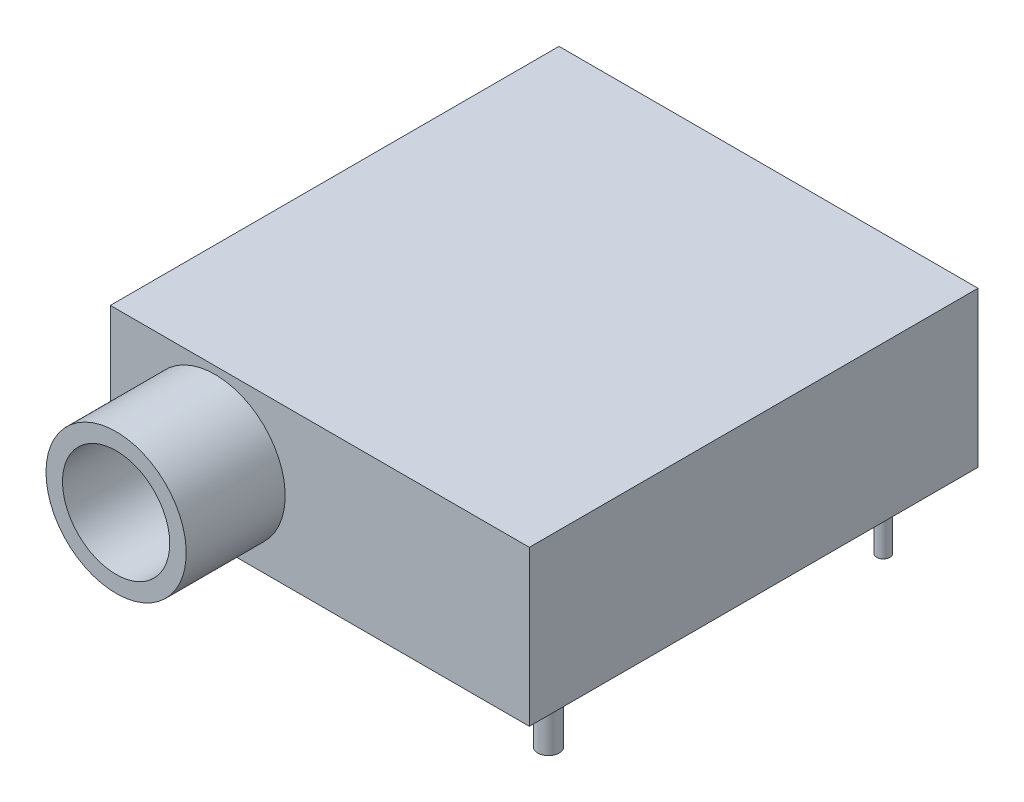
ISO-10303-21;
HEADER;
FILE_DESCRIPTION(('STEP AP214'),'2;1');
FILE_NAME('part.step','',(''),(''),'','','');
FILE_SCHEMA(('AUTOMOTIVE_DESIGN { 1 0 10303 214 1 1 1 1 }'));
ENDSEC;
DATA;
#1=APPLICATION_CONTEXT('core data for automotive mechanical design processes');
#2=APPLICATION_PROTOCOL_DEFINITION('international standard','automotive_design',2000,#1);
#3=PRODUCT_CONTEXT('',#1,'mechanical');
#4=PRODUCT('Part','Part','',(#3));
#5=PRODUCT_RELATED_PRODUCT_CATEGORY('part','',(#4));
#6=PRODUCT_DEFINITION_FORMATION('','',#4);
#7=PRODUCT_DEFINITION_CONTEXT('part definition',#1,'design');
#8=PRODUCT_DEFINITION('design','',#6,#7);
#9=PRODUCT_DEFINITION_SHAPE('','',#8);
#10=(LENGTH_UNIT() NAMED_UNIT(*) SI_UNIT(.MILLI.,.METRE.));
#11=(NAMED_UNIT(*) PLANE_ANGLE_UNIT() SI_UNIT($,.RADIAN.));
#12=(NAMED_UNIT(*) SI_UNIT($,.STERADIAN.) SOLID_ANGLE_UNIT());
#13=UNCERTAINTY_MEASURE_WITH_UNIT(LENGTH_MEASURE(1.E-05),#10,'distance_accuracy_value','');
#14=(GEOMETRIC_REPRESENTATION_CONTEXT(3) GLOBAL_UNCERTAINTY_ASSIGNED_CONTEXT((#13)) GLOBAL_UNIT_ASSIGNED_CONTEXT((#10,
#11,#12)) REPRESENTATION_CONTEXT('',''));
#15=CARTESIAN_POINT('',(0.,0.,0.));
#16=DIRECTION('',(0.,0.,1.));
#17=DIRECTION('',(1.,0.,0.));
#18=AXIS2_PLACEMENT_3D('',#15,#16,#17);
#19=CARTESIAN_POINT('',(0.,-4.7,0.));
#20=DIRECTION('',(0.,1.,0.));
#21=DIRECTION('',(0.,0.,1.));
#22=AXIS2_PLACEMENT_3D('',#19,#20,#21);
#23=PLANE('',#22);
#24=CARTESIAN_POINT('',(7.62,-4.7,-10.4));
#25=DIRECTION('',(0.,1.,0.));
#26=DIRECTION('',(0.,0.,1.));
#27=AXIS2_PLACEMENT_3D('',#24,#25,#26);
#28=CIRCLE('',#27,0.399999999999999);
#29=CARTESIAN_POINT('',(7.62,-4.7,-10.));
#30=VERTEX_POINT('',#29);
#31=EDGE_CURVE('E44',#30,#30,#28,.F.);
#32=ORIENTED_EDGE('',*,*,#31,.F.);
#33=EDGE_LOOP('',(#32));
#34=FACE_BOUND('',#33,.T.);
#35=CARTESIAN_POINT('',(2.54,-4.7,-10.4));
#36=DIRECTION('',(0.,1.,0.));
#37=DIRECTION('',(0.,0.,1.));
#38=AXIS2_PLACEMENT_3D('',#35,#36,#37);
#39=CIRCLE('',#38,0.399999999999999);
#40=CARTESIAN_POINT('',(2.54,-4.7,-10.));
#41=VERTEX_POINT('',#40);
#42=EDGE_CURVE('E138',#41,#41,#39,.F.);
#43=ORIENTED_EDGE('',*,*,#42,.F.);
#44=EDGE_LOOP('',(#43));
#45=FACE_BOUND('',#44,.T.);
#46=CARTESIAN_POINT('',(-2.54,-4.7,-10.4));
#47=DIRECTION('',(0.,1.,0.));
#48=DIRECTION('',(0.,0.,1.));
#49=AXIS2_PLACEMENT_3D('',#46,#47,#48);
#50=CIRCLE('',#49,0.399999999999999);
#51=CARTESIAN_POINT('',(-2.54,-4.7,-10.));
#52=VERTEX_POINT('',#51);
#53=EDGE_CURVE('E132',#52,#52,#50,.F.);
#54=ORIENTED_EDGE('',*,*,#53,.F.);
#55=EDGE_LOOP('',(#54));
#56=FACE_BOUND('',#55,.T.);
#57=CARTESIAN_POINT('',(-7.62,-4.7,-10.4));
#58=DIRECTION('',(0.,1.,0.));
#59=DIRECTION('',(0.,0.,1.));
#60=AXIS2_PLACEMENT_3D('',#57,#58,#59);
#61=CIRCLE('',#60,0.399999999999999);
#62=CARTESIAN_POINT('',(-7.62,-4.7,-10.));
#63=VERTEX_POINT('',#62);
#64=EDGE_CURVE('E126',#63,#63,#61,.F.);
#65=ORIENTED_EDGE('',*,*,#64,.F.);
#66=EDGE_LOOP('',(#65));
#67=FACE_BOUND('',#66,.T.);
#68=CARTESIAN_POINT('',(10.16,-4.7,9.9));
#69=DIRECTION('',(0.,1.,0.));
#70=DIRECTION('',(0.,0.,1.));
#71=AXIS2_PLACEMENT_3D('',#68,#69,#70);
#72=CIRCLE('',#71,0.649999999999999);
#73=CARTESIAN_POINT('',(10.16,-4.7,10.55));
#74=VERTEX_POINT('',#73);
#75=EDGE_CURVE('E120',#74,#74,#72,.F.);
#76=ORIENTED_EDGE('',*,*,#75,.F.);
#77=EDGE_LOOP('',(#76));
#78=FACE_BOUND('',#77,.T.);
#79=DIRECTION('',(0.,0.,1.));
#80=VECTOR('',#79,1.);
#81=CARTESIAN_POINT('',(-12.7,-4.7,-13.6));
#82=LINE('',#81,#80);
#83=CARTESIAN_POINT('',(-12.7,-4.7,-13.6));
#84=VERTEX_POINT('',#83);
#85=CARTESIAN_POINT('',(-12.7,-4.7,13.6));
#86=VERTEX_POINT('',#85);
#87=EDGE_CURVE('E80',#84,#86,#82,.T.);
#88=ORIENTED_EDGE('',*,*,#87,.F.);
#89=DIRECTION('',(-1.,0.,0.));
#90=VECTOR('',#89,1.);
#91=CARTESIAN_POINT('',(-12.7,-4.7,-13.6));
#92=LINE('',#91,#90);
#93=CARTESIAN_POINT('',(12.7,-4.7,-13.6));
#94=VERTEX_POINT('',#93);
#95=EDGE_CURVE('E85',#94,#84,#92,.T.);
#96=ORIENTED_EDGE('',*,*,#95,.F.);
#97=DIRECTION('',(0.,0.,-1.));
#98=VECTOR('',#97,1.);
#99=CARTESIAN_POINT('',(12.7,-4.7,-13.6));
#100=LINE('',#99,#98);
#101=CARTESIAN_POINT('',(12.7,-4.7,13.6));
#102=VERTEX_POINT('',#101);
#103=EDGE_CURVE('E111',#102,#94,#100,.T.);
#104=ORIENTED_EDGE('',*,*,#103,.F.);
#105=DIRECTION('',(1.,0.,0.));
#106=VECTOR('',#105,1.);
#107=CARTESIAN_POINT('',(-12.7,-4.7,13.6));
#108=LINE('',#107,#106);
#109=EDGE_CURVE('E109',#86,#102,#108,.T.);
#110=ORIENTED_EDGE('',*,*,#109,.F.);
#111=EDGE_LOOP('',(#88,#96,#104,#110));
#112=FACE_BOUND('',#111,.T.);
#113=CARTESIAN_POINT('',(-10.16,-4.7,9.9));
#114=DIRECTION('',(0.,1.,0.));
#115=DIRECTION('',(0.,0.,1.));
#116=AXIS2_PLACEMENT_3D('',#113,#114,#115);
#117=CIRCLE('',#116,0.649999999999999);
#118=CARTESIAN_POINT('',(-10.16,-4.7,10.55));
#119=VERTEX_POINT('',#118);
#120=EDGE_CURVE('E115',#119,#119,#117,.F.);
#121=ORIENTED_EDGE('',*,*,#120,.F.);
#122=EDGE_LOOP('',(#121));
#123=FACE_BOUND('',#122,.T.);
#124=CARTESIAN_POINT('',(-10.16,-4.7,-10.4));
#125=DIRECTION('',(0.,1.,0.));
#126=DIRECTION('',(0.,0.,1.));
#127=AXIS2_PLACEMENT_3D('',#124,#125,#126);
#128=CIRCLE('',#127,0.399999999999999);
#129=CARTESIAN_POINT('',(-10.16,-4.7,-10.));
#130=VERTEX_POINT('',#129);
#131=EDGE_CURVE('E123',#130,#130,#128,.F.);
#132=ORIENTED_EDGE('',*,*,#131,.F.);
#133=EDGE_LOOP('',(#132));
#134=FACE_BOUND('',#133,.T.);
#135=CARTESIAN_POINT('',(-5.08,-4.7,-10.4));
#136=DIRECTION('',(0.,1.,0.));
#137=DIRECTION('',(0.,0.,1.));
#138=AXIS2_PLACEMENT_3D('',#135,#136,#137);
#139=CIRCLE('',#138,0.399999999999999);
#140=CARTESIAN_POINT('',(-5.08,-4.7,-10.));
#141=VERTEX_POINT('',#140);
#142=EDGE_CURVE('E129',#141,#141,#139,.F.);
#143=ORIENTED_EDGE('',*,*,#142,.F.);
#144=EDGE_LOOP('',(#143));
#145=FACE_BOUND('',#144,.T.);
#146=CARTESIAN_POINT('',(0.,-4.7,-10.4));
#147=DIRECTION('',(0.,1.,0.));
#148=DIRECTION('',(0.,0.,1.));
#149=AXIS2_PLACEMENT_3D('',#146,#147,#148);
#150=CIRCLE('',#149,0.399999999999999);
#151=CARTESIAN_POINT('',(0.,-4.7,-10.));
#152=VERTEX_POINT('',#151);
#153=EDGE_CURVE('E135',#152,#152,#150,.F.);
#154=ORIENTED_EDGE('',*,*,#153,.F.);
#155=EDGE_LOOP('',(#154));
#156=FACE_BOUND('',#155,.T.);
#157=CARTESIAN_POINT('',(5.08,-4.7,-10.4));
#158=DIRECTION('',(0.,1.,0.));
#159=DIRECTION('',(0.,0.,1.));
#160=AXIS2_PLACEMENT_3D('',#157,#158,#159);
#161=CIRCLE('',#160,0.399999999999999);
#162=CARTESIAN_POINT('',(5.08,-4.7,-10.));
#163=VERTEX_POINT('',#162);
#164=EDGE_CURVE('E141',#163,#163,#161,.F.);
#165=ORIENTED_EDGE('',*,*,#164,.F.);
#166=EDGE_LOOP('',(#165));
#167=FACE_BOUND('',#166,.T.);
#168=CARTESIAN_POINT('',(10.16,-4.7,-10.4));
#169=DIRECTION('',(0.,1.,0.));
#170=DIRECTION('',(0.,0.,1.));
#171=AXIS2_PLACEMENT_3D('',#168,#169,#170);
#172=CIRCLE('',#171,0.399999999999999);
#173=CARTESIAN_POINT('',(10.16,-4.7,-10.));
#174=VERTEX_POINT('',#173);
#175=EDGE_CURVE('E12',#174,#174,#172,.F.);
#176=ORIENTED_EDGE('',*,*,#175,.F.);
#177=EDGE_LOOP('',(#176));
#178=FACE_BOUND('',#177,.T.);
#179=ADVANCED_FACE('F36',(#34,#45,#56,#67,#78,#112,#123,#134,#145,#156,#167,#178),#23,.F.);
#180=CARTESIAN_POINT('',(-12.7,-4.7,13.6));
#181=DIRECTION('',(0.,0.,1.));
#182=DIRECTION('',(1.,0.,0.));
#183=AXIS2_PLACEMENT_3D('',#180,#181,#182);
#184=PLANE('',#183);
#185=DIRECTION('',(0.,1.,0.));
#186=VECTOR('',#185,1.);
#187=CARTESIAN_POINT('',(12.7,-4.7,13.6));
#188=LINE('',#187,#186);
#189=CARTESIAN_POINT('',(12.7,4.7,13.6));
#190=VERTEX_POINT('',#189);
#191=EDGE_CURVE('E84',#102,#190,#188,.T.);
#192=ORIENTED_EDGE('',*,*,#191,.T.);
#193=DIRECTION('',(1.,0.,0.));
#194=VECTOR('',#193,1.);
#195=CARTESIAN_POINT('',(-12.7,4.7,13.6));
#196=LINE('',#195,#194);
#197=CARTESIAN_POINT('',(-12.7,4.7,13.6));
#198=VERTEX_POINT('',#197);
#199=EDGE_CURVE('E88',#198,#190,#196,.T.);
#200=ORIENTED_EDGE('',*,*,#199,.F.);
#201=DIRECTION('',(0.,1.,0.));
#202=VECTOR('',#201,1.);
#203=CARTESIAN_POINT('',(-12.7,-4.7,13.6));
#204=LINE('',#203,#202);
#205=EDGE_CURVE('E76',#86,#198,#204,.T.);
#206=ORIENTED_EDGE('',*,*,#205,.F.);
#207=ORIENTED_EDGE('',*,*,#109,.T.);
#208=EDGE_LOOP('',(#192,#200,#206,#207));
#209=FACE_BOUND('',#208,.T.);
#210=CARTESIAN_POINT('',(-6.35,0.,13.6));
#211=DIRECTION('',(0.,0.,1.));
#212=DIRECTION('',(1.,0.,0.));
#213=AXIS2_PLACEMENT_3D('',#210,#211,#212);
#214=CIRCLE('',#213,4.25);
#215=CARTESIAN_POINT('',(-10.6,0.,13.6));
#216=VERTEX_POINT('',#215);
#217=EDGE_CURVE('E102',#216,#216,#214,.T.);
#218=ORIENTED_EDGE('',*,*,#217,.F.);
#219=EDGE_LOOP('',(#218));
#220=FACE_BOUND('',#219,.T.);
#221=ADVANCED_FACE('F89',(#209,#220),#184,.T.);
#222=CARTESIAN_POINT('',(-12.7,-4.7,-13.6));
#223=DIRECTION('',(-1.,0.,0.));
#224=DIRECTION('',(0.,0.,1.));
#225=AXIS2_PLACEMENT_3D('',#222,#223,#224);
#226=PLANE('',#225);
#227=ORIENTED_EDGE('',*,*,#205,.T.);
#228=DIRECTION('',(0.,0.,1.));
#229=VECTOR('',#228,1.);
#230=CARTESIAN_POINT('',(-12.7,4.7,-13.6));
#231=LINE('',#230,#229);
#232=CARTESIAN_POINT('',(-12.7,4.7,-13.6));
#233=VERTEX_POINT('',#232);
#234=EDGE_CURVE('E79',#233,#198,#231,.T.);
#235=ORIENTED_EDGE('',*,*,#234,.F.);
#236=DIRECTION('',(0.,1.,0.));
#237=VECTOR('',#236,1.);
#238=CARTESIAN_POINT('',(-12.7,-4.7,-13.6));
#239=LINE('',#238,#237);
#240=EDGE_CURVE('E51',#84,#233,#239,.T.);
#241=ORIENTED_EDGE('',*,*,#240,.F.);
#242=ORIENTED_EDGE('',*,*,#87,.T.);
#243=EDGE_LOOP('',(#227,#235,#241,#242));
#244=FACE_BOUND('',#243,.T.);
#245=ADVANCED_FACE('F38',(#244),#226,.T.);
#246=CARTESIAN_POINT('',(-12.7,-4.7,-13.6));
#247=DIRECTION('',(0.,0.,-1.));
#248=DIRECTION('',(-1.,0.,0.));
#249=AXIS2_PLACEMENT_3D('',#246,#247,#248);
#250=PLANE('',#249);
#251=ORIENTED_EDGE('',*,*,#240,.T.);
#252=DIRECTION('',(-1.,0.,0.));
#253=VECTOR('',#252,1.);
#254=CARTESIAN_POINT('',(-12.7,4.7,-13.6));
#255=LINE('',#254,#253);
#256=CARTESIAN_POINT('',(12.7,4.7,-13.6));
#257=VERTEX_POINT('',#256);
#258=EDGE_CURVE('E98',#257,#233,#255,.T.);
#259=ORIENTED_EDGE('',*,*,#258,.F.);
#260=DIRECTION('',(0.,1.,0.));
#261=VECTOR('',#260,1.);
#262=CARTESIAN_POINT('',(12.7,-4.7,-13.6));
#263=LINE('',#262,#261);
#264=EDGE_CURVE('E59',#94,#257,#263,.T.);
#265=ORIENTED_EDGE('',*,*,#264,.F.);
#266=ORIENTED_EDGE('',*,*,#95,.T.);
#267=EDGE_LOOP('',(#251,#259,#265,#266));
#268=FACE_BOUND('',#267,.T.);
#269=ADVANCED_FACE('F283',(#268),#250,.T.);
#270=CARTESIAN_POINT('',(12.7,-4.7,-13.6));
#271=DIRECTION('',(1.,0.,0.));
#272=DIRECTION('',(0.,0.,-1.));
#273=AXIS2_PLACEMENT_3D('',#270,#271,#272);
#274=PLANE('',#273);
#275=ORIENTED_EDGE('',*,*,#264,.T.);
#276=DIRECTION('',(0.,0.,-1.));
#277=VECTOR('',#276,1.);
#278=CARTESIAN_POINT('',(12.7,4.7,-13.6));
#279=LINE('',#278,#277);
#280=EDGE_CURVE('E94',#190,#257,#279,.T.);
#281=ORIENTED_EDGE('',*,*,#280,.F.);
#282=ORIENTED_EDGE('',*,*,#191,.F.);
#283=ORIENTED_EDGE('',*,*,#103,.T.);
#284=EDGE_LOOP('',(#275,#281,#282,#283));
#285=FACE_BOUND('',#284,.T.);
#286=ADVANCED_FACE('F281',(#285),#274,.T.);
#287=CARTESIAN_POINT('',(0.,4.7,0.));
#288=DIRECTION('',(0.,1.,0.));
#289=DIRECTION('',(0.,0.,1.));
#290=AXIS2_PLACEMENT_3D('',#287,#288,#289);
#291=PLANE('',#290);
#292=ORIENTED_EDGE('',*,*,#234,.T.);
#293=ORIENTED_EDGE('',*,*,#199,.T.);
#294=ORIENTED_EDGE('',*,*,#280,.T.);
#295=ORIENTED_EDGE('',*,*,#258,.T.);
#296=EDGE_LOOP('',(#292,#293,#294,#295));
#297=FACE_BOUND('',#296,.T.);
#298=ADVANCED_FACE('F97',(#297),#291,.T.);
#299=CARTESIAN_POINT('',(-6.35,0.,64.8208152801713));
#300=DIRECTION('',(0.,0.,-1.));
#301=DIRECTION('',(-1.,0.,0.));
#302=AXIS2_PLACEMENT_3D('',#299,#300,#301);
#303=CYLINDRICAL_SURFACE('',#302,4.25);
#304=CARTESIAN_POINT('',(-6.35,0.,19.6));
#305=DIRECTION('',(0.,0.,-1.));
#306=DIRECTION('',(-1.,0.,0.));
#307=AXIS2_PLACEMENT_3D('',#304,#305,#306);
#308=CIRCLE('',#307,4.25);
#309=CARTESIAN_POINT('',(-10.6,0.,19.6));
#310=VERTEX_POINT('',#309);
#311=EDGE_CURVE('E99',#310,#310,#308,.T.);
#312=CARTESIAN_POINT('',(-10.6,0.,19.6));
#313=CARTESIAN_POINT('',(-10.6,0.,19.5375));
#314=CARTESIAN_POINT('',(-10.6,0.,19.475));
#315=CARTESIAN_POINT('',(-10.6,0.,19.35));
#316=CARTESIAN_POINT('',(-10.6,0.,19.2875));
#317=CARTESIAN_POINT('',(-10.6,0.,19.1625));
#318=CARTESIAN_POINT('',(-10.6,0.,19.1));
#319=CARTESIAN_POINT('',(-10.6,0.,18.975));
#320=CARTESIAN_POINT('',(-10.6,0.,18.9125));
#321=CARTESIAN_POINT('',(-10.6,0.,18.7875));
#322=CARTESIAN_POINT('',(-10.6,0.,18.725));
#323=CARTESIAN_POINT('',(-10.6,0.,18.6));
#324=CARTESIAN_POINT('',(-10.6,0.,18.5375));
#325=CARTESIAN_POINT('',(-10.6,0.,18.4125));
#326=CARTESIAN_POINT('',(-10.6,0.,18.35));
#327=CARTESIAN_POINT('',(-10.6,0.,18.225));
#328=CARTESIAN_POINT('',(-10.6,0.,18.1625));
#329=CARTESIAN_POINT('',(-10.6,0.,18.0375));
#330=CARTESIAN_POINT('',(-10.6,0.,17.975));
#331=CARTESIAN_POINT('',(-10.6,0.,17.85));
#332=CARTESIAN_POINT('',(-10.6,0.,17.7875));
#333=CARTESIAN_POINT('',(-10.6,0.,17.6625));
#334=CARTESIAN_POINT('',(-10.6,0.,17.6));
#335=CARTESIAN_POINT('',(-10.6,0.,17.475));
#336=CARTESIAN_POINT('',(-10.6,0.,17.4125));
#337=CARTESIAN_POINT('',(-10.6,0.,17.2875));
#338=CARTESIAN_POINT('',(-10.6,0.,17.225));
#339=CARTESIAN_POINT('',(-10.6,0.,17.1));
#340=CARTESIAN_POINT('',(-10.6,0.,17.0375));
#341=CARTESIAN_POINT('',(-10.6,0.,16.9125));
#342=CARTESIAN_POINT('',(-10.6,0.,16.85));
#343=CARTESIAN_POINT('',(-10.6,0.,16.725));
#344=CARTESIAN_POINT('',(-10.6,0.,16.6625));
#345=CARTESIAN_POINT('',(-10.6,0.,16.5375));
#346=CARTESIAN_POINT('',(-10.6,0.,16.475));
#347=CARTESIAN_POINT('',(-10.6,0.,16.35));
#348=CARTESIAN_POINT('',(-10.6,0.,16.2875));
#349=CARTESIAN_POINT('',(-10.6,0.,16.1625));
#350=CARTESIAN_POINT('',(-10.6,0.,16.1));
#351=CARTESIAN_POINT('',(-10.6,0.,15.975));
#352=CARTESIAN_POINT('',(-10.6,0.,15.9125));
#353=CARTESIAN_POINT('',(-10.6,0.,15.7875));
#354=CARTESIAN_POINT('',(-10.6,0.,15.725));
#355=CARTESIAN_POINT('',(-10.6,0.,15.6));
#356=CARTESIAN_POINT('',(-10.6,0.,15.5375));
#357=CARTESIAN_POINT('',(-10.6,0.,15.4125));
#358=CARTESIAN_POINT('',(-10.6,0.,15.35));
#359=CARTESIAN_POINT('',(-10.6,0.,15.225));
#360=CARTESIAN_POINT('',(-10.6,0.,15.1625));
#361=CARTESIAN_POINT('',(-10.6,0.,15.0375));
#362=CARTESIAN_POINT('',(-10.6,0.,14.975));
#363=CARTESIAN_POINT('',(-10.6,0.,14.85));
#364=CARTESIAN_POINT('',(-10.6,0.,14.7875));
#365=CARTESIAN_POINT('',(-10.6,0.,14.6625));
#366=CARTESIAN_POINT('',(-10.6,0.,14.6));
#367=CARTESIAN_POINT('',(-10.6,0.,14.475));
#368=CARTESIAN_POINT('',(-10.6,0.,14.4125));
#369=CARTESIAN_POINT('',(-10.6,0.,14.2875));
#370=CARTESIAN_POINT('',(-10.6,0.,14.225));
#371=CARTESIAN_POINT('',(-10.6,0.,14.1));
#372=CARTESIAN_POINT('',(-10.6,0.,14.0375));
#373=CARTESIAN_POINT('',(-10.6,0.,13.9125));
#374=CARTESIAN_POINT('',(-10.6,0.,13.85));
#375=CARTESIAN_POINT('',(-10.6,0.,13.725));
#376=CARTESIAN_POINT('',(-10.6,0.,13.6625));
#377=CARTESIAN_POINT('',(-10.6,0.,13.6));
#378=B_SPLINE_CURVE_WITH_KNOTS('',3,(#312,#313,#314,#315,#316,#317,#318,#319,#320,#321,#322,
#323,#324,#325,#326,#327,#328,#329,#330,#331,#332,#333,#334,#335,#336,#337,#338,#339,#340,#341,
#342,#343,#344,#345,#346,#347,#348,#349,#350,#351,#352,#353,#354,#355,#356,#357,#358,#359,#360,
#361,#362,#363,#364,#365,#366,#367,#368,#369,#370,#371,#372,#373,#374,#375,#376,#377),
.UNSPECIFIED.,.F.,.F.,(4,2,2,2,2,2,2,2,2,2,2,2,2,2,2,2,2,2,2,2,2,2,2,2,2,2,2,2,2,2,2,2,4),(0.,
0.1875,0.375,0.5625,0.750000000000001,0.937500000000001,1.125,1.3125,1.5,1.6875,1.875,2.0625,
2.25,2.4375,2.625,2.8125,3.,3.1875,3.375,3.5625,3.75,3.9375,4.125,4.3125,4.5,4.6875,4.875,
5.0625,5.25,5.4375,5.62500000000001,5.81250000000001,6.00000000000001),.UNSPECIFIED.);
#379=EDGE_CURVE('BSEAM275',#310,#216,#378,.T.);
#380=ORIENTED_EDGE('',*,*,#311,.T.);
#381=ORIENTED_EDGE('',*,*,#217,.T.);
#382=ORIENTED_EDGE('',*,*,#379,.T.);
#383=ORIENTED_EDGE('',*,*,#379,.F.);
#384=EDGE_LOOP('',(#380,#382,#381,#383));
#385=FACE_BOUND('',#384,.T.);
#386=ADVANCED_FACE('F275',(#385),#303,.T.);
#387=CARTESIAN_POINT('',(-12.7,-4.7,19.6));
#388=DIRECTION('',(0.,0.,-1.));
#389=DIRECTION('',(-1.,0.,0.));
#390=AXIS2_PLACEMENT_3D('',#387,#388,#389);
#391=PLANE('',#390);
#392=CARTESIAN_POINT('',(-6.35,0.,19.6));
#393=DIRECTION('',(0.,0.,1.));
#394=DIRECTION('',(1.,0.,0.));
#395=AXIS2_PLACEMENT_3D('',#392,#393,#394);
#396=CIRCLE('',#395,3.25);
#397=CARTESIAN_POINT('',(-3.1,0.,19.6));
#398=VERTEX_POINT('',#397);
#399=EDGE_CURVE('E487',#398,#398,#396,.T.);
#400=ORIENTED_EDGE('',*,*,#399,.F.);
#401=EDGE_LOOP('',(#400));
#402=FACE_BOUND('',#401,.T.);
#403=ORIENTED_EDGE('',*,*,#311,.F.);
#404=EDGE_LOOP('',(#403));
#405=FACE_BOUND('',#404,.T.);
#406=ADVANCED_FACE('F271',(#402,#405),#391,.F.);
#407=CARTESIAN_POINT('',(-6.35,0.,14.6));
#408=DIRECTION('',(0.,0.,1.));
#409=DIRECTION('',(1.,0.,0.));
#410=AXIS2_PLACEMENT_3D('',#407,#408,#409);
#411=CYLINDRICAL_SURFACE('',#410,3.25);
#412=CARTESIAN_POINT('',(-6.35,0.,14.6));
#413=DIRECTION('',(0.,0.,1.));
#414=DIRECTION('',(1.,0.,0.));
#415=AXIS2_PLACEMENT_3D('',#412,#413,#414);
#416=CIRCLE('',#415,3.25);
#417=CARTESIAN_POINT('',(-3.1,0.,14.6));
#418=VERTEX_POINT('',#417);
#419=EDGE_CURVE('E485',#418,#418,#416,.T.);
#420=ORIENTED_EDGE('',*,*,#419,.F.);
#421=EDGE_LOOP('',(#420));
#422=FACE_BOUND('',#421,.T.);
#423=ORIENTED_EDGE('',*,*,#399,.T.);
#424=EDGE_LOOP('',(#423));
#425=FACE_BOUND('',#424,.T.);
#426=ADVANCED_FACE('F267',(#422,#425),#411,.F.);
#427=CARTESIAN_POINT('',(-6.35,0.,14.6));
#428=DIRECTION('',(0.,0.,1.));
#429=DIRECTION('',(1.,0.,0.));
#430=AXIS2_PLACEMENT_3D('',#427,#428,#429);
#431=PLANE('',#430);
#432=ORIENTED_EDGE('',*,*,#419,.T.);
#433=EDGE_LOOP('',(#432));
#434=FACE_BOUND('',#433,.T.);
#435=ADVANCED_FACE('F263',(#434),#431,.T.);
#436=CARTESIAN_POINT('',(-10.16,-8.9,9.9));
#437=DIRECTION('',(0.,1.,0.));
#438=DIRECTION('',(0.,0.,1.));
#439=AXIS2_PLACEMENT_3D('',#436,#437,#438);
#440=CYLINDRICAL_SURFACE('',#439,0.649999999999999);
#441=CARTESIAN_POINT('',(-10.16,-8.9,9.9));
#442=DIRECTION('',(0.,-1.,0.));
#443=DIRECTION('',(0.,0.,-1.));
#444=AXIS2_PLACEMENT_3D('',#441,#442,#443);
#445=CIRCLE('',#444,0.649999999999999);
#446=CARTESIAN_POINT('',(-10.16,-8.9,9.25));
#447=VERTEX_POINT('',#446);
#448=EDGE_CURVE('E491',#447,#447,#445,.T.);
#449=ORIENTED_EDGE('',*,*,#448,.F.);
#450=EDGE_LOOP('',(#449));
#451=FACE_BOUND('',#450,.T.);
#452=ORIENTED_EDGE('',*,*,#120,.T.);
#453=EDGE_LOOP('',(#452));
#454=FACE_BOUND('',#453,.T.);
#455=ADVANCED_FACE('F259',(#451,#454),#440,.T.);
#456=CARTESIAN_POINT('',(-10.16,-8.9,9.9));
#457=DIRECTION('',(0.,-1.,0.));
#458=DIRECTION('',(0.,0.,-1.));
#459=AXIS2_PLACEMENT_3D('',#456,#457,#458);
#460=PLANE('',#459);
#461=ORIENTED_EDGE('',*,*,#448,.T.);
#462=EDGE_LOOP('',(#461));
#463=FACE_BOUND('',#462,.T.);
#464=ADVANCED_FACE('F255',(#463),#460,.T.);
#465=CARTESIAN_POINT('',(10.16,-8.9,9.9));
#466=DIRECTION('',(0.,1.,0.));
#467=DIRECTION('',(0.,0.,1.));
#468=AXIS2_PLACEMENT_3D('',#465,#466,#467);
#469=CYLINDRICAL_SURFACE('',#468,0.649999999999999);
#470=CARTESIAN_POINT('',(10.16,-8.9,9.9));
#471=DIRECTION('',(0.,-1.,0.));
#472=DIRECTION('',(0.,0.,1.));
#473=AXIS2_PLACEMENT_3D('',#470,#471,#472);
#474=CIRCLE('',#473,0.649999999999999);
#475=CARTESIAN_POINT('',(10.16,-8.9,10.55));
#476=VERTEX_POINT('',#475);
#477=EDGE_CURVE('E495',#476,#476,#474,.T.);
#478=ORIENTED_EDGE('',*,*,#477,.F.);
#479=EDGE_LOOP('',(#478));
#480=FACE_BOUND('',#479,.T.);
#481=ORIENTED_EDGE('',*,*,#75,.T.);
#482=EDGE_LOOP('',(#481));
#483=FACE_BOUND('',#482,.T.);
#484=ADVANCED_FACE('F251',(#480,#483),#469,.T.);
#485=CARTESIAN_POINT('',(10.16,-8.9,9.9));
#486=DIRECTION('',(0.,1.,0.));
#487=DIRECTION('',(0.,0.,1.));
#488=AXIS2_PLACEMENT_3D('',#485,#486,#487);
#489=PLANE('',#488);
#490=ORIENTED_EDGE('',*,*,#477,.T.);
#491=EDGE_LOOP('',(#490));
#492=FACE_BOUND('',#491,.T.);
#493=ADVANCED_FACE('F247',(#492),#489,.F.);
#494=CARTESIAN_POINT('',(-10.16,-8.9,-10.4));
#495=DIRECTION('',(0.,1.,0.));
#496=DIRECTION('',(0.,0.,1.));
#497=AXIS2_PLACEMENT_3D('',#494,#495,#496);
#498=CYLINDRICAL_SURFACE('',#497,0.399999999999999);
#499=CARTESIAN_POINT('',(-10.16,-8.9,-10.4));
#500=DIRECTION('',(0.,-1.,0.));
#501=DIRECTION('',(0.,0.,-1.));
#502=AXIS2_PLACEMENT_3D('',#499,#500,#501);
#503=CIRCLE('',#502,0.399999999999999);
#504=CARTESIAN_POINT('',(-10.16,-8.9,-10.8));
#505=VERTEX_POINT('',#504);
#506=EDGE_CURVE('E498',#505,#505,#503,.T.);
#507=ORIENTED_EDGE('',*,*,#506,.F.);
#508=EDGE_LOOP('',(#507));
#509=FACE_BOUND('',#508,.T.);
#510=ORIENTED_EDGE('',*,*,#131,.T.);
#511=EDGE_LOOP('',(#510));
#512=FACE_BOUND('',#511,.T.);
#513=ADVANCED_FACE('F243',(#509,#512),#498,.T.);
#514=CARTESIAN_POINT('',(-10.16,-8.9,-10.4));
#515=DIRECTION('',(0.,-1.,0.));
#516=DIRECTION('',(0.,0.,-1.));
#517=AXIS2_PLACEMENT_3D('',#514,#515,#516);
#518=PLANE('',#517);
#519=ORIENTED_EDGE('',*,*,#506,.T.);
#520=EDGE_LOOP('',(#519));
#521=FACE_BOUND('',#520,.T.);
#522=ADVANCED_FACE('F239',(#521),#518,.T.);
#523=CARTESIAN_POINT('',(-7.62,-8.9,-10.4));
#524=DIRECTION('',(0.,1.,0.));
#525=DIRECTION('',(0.,0.,1.));
#526=AXIS2_PLACEMENT_3D('',#523,#524,#525);
#527=CYLINDRICAL_SURFACE('',#526,0.399999999999999);
#528=CARTESIAN_POINT('',(-7.62,-8.9,-10.4));
#529=DIRECTION('',(0.,-1.,0.));
#530=DIRECTION('',(0.,0.,-1.));
#531=AXIS2_PLACEMENT_3D('',#528,#529,#530);
#532=CIRCLE('',#531,0.399999999999999);
#533=CARTESIAN_POINT('',(-7.62,-8.9,-10.8));
#534=VERTEX_POINT('',#533);
#535=EDGE_CURVE('E501',#534,#534,#532,.T.);
#536=ORIENTED_EDGE('',*,*,#535,.F.);
#537=EDGE_LOOP('',(#536));
#538=FACE_BOUND('',#537,.T.);
#539=ORIENTED_EDGE('',*,*,#64,.T.);
#540=EDGE_LOOP('',(#539));
#541=FACE_BOUND('',#540,.T.);
#542=ADVANCED_FACE('F235',(#538,#541),#527,.T.);
#543=CARTESIAN_POINT('',(-7.62,-8.9,-10.4));
#544=DIRECTION('',(0.,-1.,0.));
#545=DIRECTION('',(0.,0.,-1.));
#546=AXIS2_PLACEMENT_3D('',#543,#544,#545);
#547=PLANE('',#546);
#548=ORIENTED_EDGE('',*,*,#535,.T.);
#549=EDGE_LOOP('',(#548));
#550=FACE_BOUND('',#549,.T.);
#551=ADVANCED_FACE('F231',(#550),#547,.T.);
#552=CARTESIAN_POINT('',(-5.08,-8.9,-10.4));
#553=DIRECTION('',(0.,1.,0.));
#554=DIRECTION('',(0.,0.,1.));
#555=AXIS2_PLACEMENT_3D('',#552,#553,#554);
#556=CYLINDRICAL_SURFACE('',#555,0.399999999999999);
#557=CARTESIAN_POINT('',(-5.08,-8.9,-10.4));
#558=DIRECTION('',(0.,-1.,0.));
#559=DIRECTION('',(0.,0.,-1.));
#560=AXIS2_PLACEMENT_3D('',#557,#558,#559);
#561=CIRCLE('',#560,0.399999999999999);
#562=CARTESIAN_POINT('',(-5.08,-8.9,-10.8));
#563=VERTEX_POINT('',#562);
#564=EDGE_CURVE('E504',#563,#563,#561,.T.);
#565=ORIENTED_EDGE('',*,*,#564,.F.);
#566=EDGE_LOOP('',(#565));
#567=FACE_BOUND('',#566,.T.);
#568=ORIENTED_EDGE('',*,*,#142,.T.);
#569=EDGE_LOOP('',(#568));
#570=FACE_BOUND('',#569,.T.);
#571=ADVANCED_FACE('F227',(#567,#570),#556,.T.);
#572=CARTESIAN_POINT('',(-5.08,-8.9,-10.4));
#573=DIRECTION('',(0.,-1.,0.));
#574=DIRECTION('',(0.,0.,-1.));
#575=AXIS2_PLACEMENT_3D('',#572,#573,#574);
#576=PLANE('',#575);
#577=ORIENTED_EDGE('',*,*,#564,.T.);
#578=EDGE_LOOP('',(#577));
#579=FACE_BOUND('',#578,.T.);
#580=ADVANCED_FACE('F223',(#579),#576,.T.);
#581=CARTESIAN_POINT('',(-2.54,-8.9,-10.4));
#582=DIRECTION('',(0.,1.,0.));
#583=DIRECTION('',(0.,0.,1.));
#584=AXIS2_PLACEMENT_3D('',#581,#582,#583);
#585=CYLINDRICAL_SURFACE('',#584,0.399999999999999);
#586=CARTESIAN_POINT('',(-2.54,-8.9,-10.4));
#587=DIRECTION('',(0.,-1.,0.));
#588=DIRECTION('',(0.,0.,-1.));
#589=AXIS2_PLACEMENT_3D('',#586,#587,#588);
#590=CIRCLE('',#589,0.399999999999999);
#591=CARTESIAN_POINT('',(-2.54,-8.9,-10.8));
#592=VERTEX_POINT('',#591);
#593=EDGE_CURVE('E507',#592,#592,#590,.T.);
#594=ORIENTED_EDGE('',*,*,#593,.F.);
#595=EDGE_LOOP('',(#594));
#596=FACE_BOUND('',#595,.T.);
#597=ORIENTED_EDGE('',*,*,#53,.T.);
#598=EDGE_LOOP('',(#597));
#599=FACE_BOUND('',#598,.T.);
#600=ADVANCED_FACE('F219',(#596,#599),#585,.T.);
#601=CARTESIAN_POINT('',(-2.54,-8.9,-10.4));
#602=DIRECTION('',(0.,-1.,0.));
#603=DIRECTION('',(0.,0.,-1.));
#604=AXIS2_PLACEMENT_3D('',#601,#602,#603);
#605=PLANE('',#604);
#606=ORIENTED_EDGE('',*,*,#593,.T.);
#607=EDGE_LOOP('',(#606));
#608=FACE_BOUND('',#607,.T.);
#609=ADVANCED_FACE('F215',(#608),#605,.T.);
#610=CARTESIAN_POINT('',(0.,-8.9,-10.4));
#611=DIRECTION('',(0.,1.,0.));
#612=DIRECTION('',(0.,0.,1.));
#613=AXIS2_PLACEMENT_3D('',#610,#611,#612);
#614=CYLINDRICAL_SURFACE('',#613,0.399999999999999);
#615=CARTESIAN_POINT('',(0.,-8.9,-10.4));
#616=DIRECTION('',(0.,-1.,0.));
#617=DIRECTION('',(0.,0.,-1.));
#618=AXIS2_PLACEMENT_3D('',#615,#616,#617);
#619=CIRCLE('',#618,0.399999999999999);
#620=CARTESIAN_POINT('',(0.,-8.9,-10.8));
#621=VERTEX_POINT('',#620);
#622=EDGE_CURVE('E510',#621,#621,#619,.T.);
#623=ORIENTED_EDGE('',*,*,#622,.F.);
#624=EDGE_LOOP('',(#623));
#625=FACE_BOUND('',#624,.T.);
#626=ORIENTED_EDGE('',*,*,#153,.T.);
#627=EDGE_LOOP('',(#626));
#628=FACE_BOUND('',#627,.T.);
#629=ADVANCED_FACE('F211',(#625,#628),#614,.T.);
#630=CARTESIAN_POINT('',(0.,-8.9,-10.4));
#631=DIRECTION('',(0.,-1.,0.));
#632=DIRECTION('',(0.,0.,-1.));
#633=AXIS2_PLACEMENT_3D('',#630,#631,#632);
#634=PLANE('',#633);
#635=ORIENTED_EDGE('',*,*,#622,.T.);
#636=EDGE_LOOP('',(#635));
#637=FACE_BOUND('',#636,.T.);
#638=ADVANCED_FACE('F207',(#637),#634,.T.);
#639=CARTESIAN_POINT('',(2.54,-8.9,-10.4));
#640=DIRECTION('',(0.,1.,0.));
#641=DIRECTION('',(0.,0.,1.));
#642=AXIS2_PLACEMENT_3D('',#639,#640,#641);
#643=CYLINDRICAL_SURFACE('',#642,0.399999999999999);
#644=CARTESIAN_POINT('',(2.54,-8.9,-10.4));
#645=DIRECTION('',(0.,-1.,0.));
#646=DIRECTION('',(0.,0.,-1.));
#647=AXIS2_PLACEMENT_3D('',#644,#645,#646);
#648=CIRCLE('',#647,0.399999999999999);
#649=CARTESIAN_POINT('',(2.54,-8.9,-10.8));
#650=VERTEX_POINT('',#649);
#651=EDGE_CURVE('E513',#650,#650,#648,.T.);
#652=ORIENTED_EDGE('',*,*,#651,.F.);
#653=EDGE_LOOP('',(#652));
#654=FACE_BOUND('',#653,.T.);
#655=ORIENTED_EDGE('',*,*,#42,.T.);
#656=EDGE_LOOP('',(#655));
#657=FACE_BOUND('',#656,.T.);
#658=ADVANCED_FACE('F203',(#654,#657),#643,.T.);
#659=CARTESIAN_POINT('',(2.54,-8.9,-10.4));
#660=DIRECTION('',(0.,-1.,0.));
#661=DIRECTION('',(0.,0.,-1.));
#662=AXIS2_PLACEMENT_3D('',#659,#660,#661);
#663=PLANE('',#662);
#664=ORIENTED_EDGE('',*,*,#651,.T.);
#665=EDGE_LOOP('',(#664));
#666=FACE_BOUND('',#665,.T.);
#667=ADVANCED_FACE('F199',(#666),#663,.T.);
#668=CARTESIAN_POINT('',(5.08,-8.9,-10.4));
#669=DIRECTION('',(0.,1.,0.));
#670=DIRECTION('',(0.,0.,1.));
#671=AXIS2_PLACEMENT_3D('',#668,#669,#670);
#672=CYLINDRICAL_SURFACE('',#671,0.399999999999999);
#673=CARTESIAN_POINT('',(5.08,-8.9,-10.4));
#674=DIRECTION('',(0.,-1.,0.));
#675=DIRECTION('',(0.,0.,-1.));
#676=AXIS2_PLACEMENT_3D('',#673,#674,#675);
#677=CIRCLE('',#676,0.399999999999999);
#678=CARTESIAN_POINT('',(5.08,-8.9,-10.8));
#679=VERTEX_POINT('',#678);
#680=EDGE_CURVE('E516',#679,#679,#677,.T.);
#681=ORIENTED_EDGE('',*,*,#680,.F.);
#682=EDGE_LOOP('',(#681));
#683=FACE_BOUND('',#682,.T.);
#684=ORIENTED_EDGE('',*,*,#164,.T.);
#685=EDGE_LOOP('',(#684));
#686=FACE_BOUND('',#685,.T.);
#687=ADVANCED_FACE('F195',(#683,#686),#672,.T.);
#688=CARTESIAN_POINT('',(5.08,-8.9,-10.4));
#689=DIRECTION('',(0.,-1.,0.));
#690=DIRECTION('',(0.,0.,-1.));
#691=AXIS2_PLACEMENT_3D('',#688,#689,#690);
#692=PLANE('',#691);
#693=ORIENTED_EDGE('',*,*,#680,.T.);
#694=EDGE_LOOP('',(#693));
#695=FACE_BOUND('',#694,.T.);
#696=ADVANCED_FACE('F191',(#695),#692,.T.);
#697=CARTESIAN_POINT('',(7.62,-8.9,-10.4));
#698=DIRECTION('',(0.,1.,0.));
#699=DIRECTION('',(0.,0.,1.));
#700=AXIS2_PLACEMENT_3D('',#697,#698,#699);
#701=CYLINDRICAL_SURFACE('',#700,0.399999999999999);
#702=CARTESIAN_POINT('',(7.62,-8.9,-10.4));
#703=DIRECTION('',(0.,-1.,0.));
#704=DIRECTION('',(0.,0.,-1.));
#705=AXIS2_PLACEMENT_3D('',#702,#703,#704);
#706=CIRCLE('',#705,0.399999999999999);
#707=CARTESIAN_POINT('',(7.62,-8.9,-10.8));
#708=VERTEX_POINT('',#707);
#709=EDGE_CURVE('E519',#708,#708,#706,.T.);
#710=ORIENTED_EDGE('',*,*,#709,.F.);
#711=EDGE_LOOP('',(#710));
#712=FACE_BOUND('',#711,.T.);
#713=ORIENTED_EDGE('',*,*,#31,.T.);
#714=EDGE_LOOP('',(#713));
#715=FACE_BOUND('',#714,.T.);
#716=ADVANCED_FACE('F146',(#712,#715),#701,.T.);
#717=CARTESIAN_POINT('',(7.62,-8.9,-10.4));
#718=DIRECTION('',(0.,-1.,0.));
#719=DIRECTION('',(0.,0.,-1.));
#720=AXIS2_PLACEMENT_3D('',#717,#718,#719);
#721=PLANE('',#720);
#722=ORIENTED_EDGE('',*,*,#709,.T.);
#723=EDGE_LOOP('',(#722));
#724=FACE_BOUND('',#723,.T.);
#725=ADVANCED_FACE('F176',(#724),#721,.T.);
#726=CARTESIAN_POINT('',(10.16,-8.9,-10.4));
#727=DIRECTION('',(0.,1.,0.));
#728=DIRECTION('',(0.,0.,1.));
#729=AXIS2_PLACEMENT_3D('',#726,#727,#728);
#730=CYLINDRICAL_SURFACE('',#729,0.399999999999999);
#731=CARTESIAN_POINT('',(10.16,-8.9,-10.4));
#732=DIRECTION('',(0.,-1.,0.));
#733=DIRECTION('',(0.,0.,-1.));
#734=AXIS2_PLACEMENT_3D('',#731,#732,#733);
#735=CIRCLE('',#734,0.399999999999999);
#736=CARTESIAN_POINT('',(10.16,-8.9,-10.8));
#737=VERTEX_POINT('',#736);
#738=EDGE_CURVE('E522',#737,#737,#735,.T.);
#739=ORIENTED_EDGE('',*,*,#738,.F.);
#740=EDGE_LOOP('',(#739));
#741=FACE_BOUND('',#740,.T.);
#742=ORIENTED_EDGE('',*,*,#175,.T.);
#743=EDGE_LOOP('',(#742));
#744=FACE_BOUND('',#743,.T.);
#745=ADVANCED_FACE('F173',(#741,#744),#730,.T.);
#746=CARTESIAN_POINT('',(10.16,-8.9,-10.4));
#747=DIRECTION('',(0.,-1.,0.));
#748=DIRECTION('',(0.,0.,-1.));
#749=AXIS2_PLACEMENT_3D('',#746,#747,#748);
#750=PLANE('',#749);
#751=ORIENTED_EDGE('',*,*,#738,.T.);
#752=EDGE_LOOP('',(#751));
#753=FACE_BOUND('',#752,.T.);
#754=ADVANCED_FACE('F175',(#753),#750,.T.);
#755=CLOSED_SHELL('',(#179,#221,#245,#269,#286,#298,#386,#406,#426,#435,#455,#464,#484,#493,
#513,#522,#542,#551,#571,#580,#600,#609,#629,#638,#658,#667,#687,#696,#716,#725,#745,#754));
#756=MANIFOLD_SOLID_BREP('B2',#755);
#757=ADVANCED_BREP_SHAPE_REPRESENTATION('',(#18,#756),#14);
#758=SHAPE_DEFINITION_REPRESENTATION(#9,#757);
ENDSEC;
END-ISO-10303-21;
